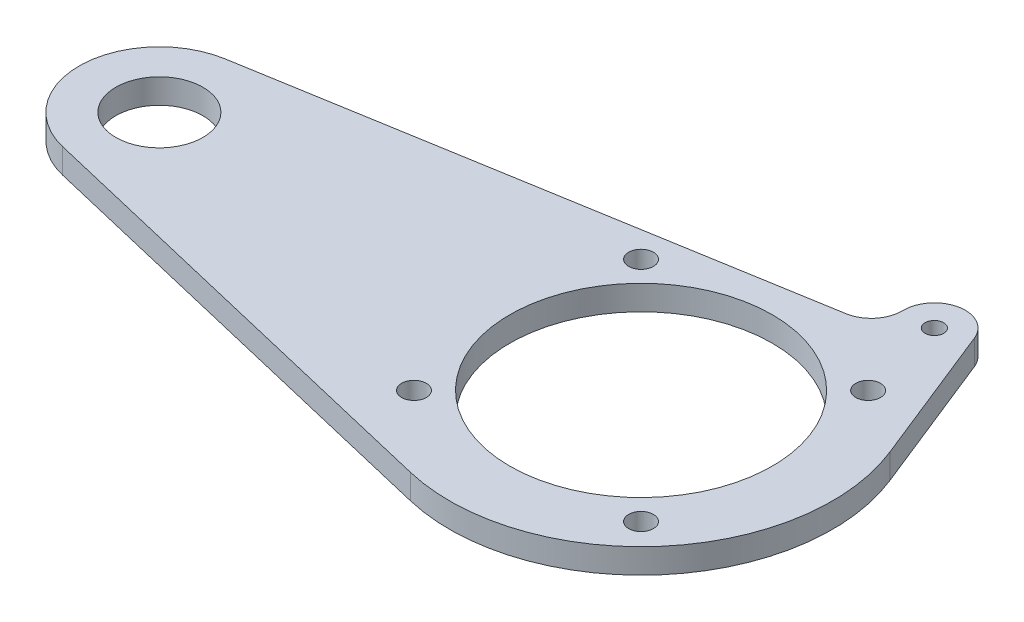
ISO-10303-21;
HEADER;
FILE_DESCRIPTION(('STEP AP214'),'2;1');
FILE_NAME('part.step','',(''),(''),'','','');
FILE_SCHEMA(('AUTOMOTIVE_DESIGN { 1 0 10303 214 1 1 1 1 }'));
ENDSEC;
DATA;
#1=APPLICATION_CONTEXT('core data for automotive mechanical design processes');
#2=APPLICATION_PROTOCOL_DEFINITION('international standard','automotive_design',2000,#1);
#3=PRODUCT_CONTEXT('',#1,'mechanical');
#4=PRODUCT('Part','Part','',(#3));
#5=PRODUCT_RELATED_PRODUCT_CATEGORY('part','',(#4));
#6=PRODUCT_DEFINITION_FORMATION('','',#4);
#7=PRODUCT_DEFINITION_CONTEXT('part definition',#1,'design');
#8=PRODUCT_DEFINITION('design','',#6,#7);
#9=PRODUCT_DEFINITION_SHAPE('','',#8);
#10=(LENGTH_UNIT() NAMED_UNIT(*) SI_UNIT(.MILLI.,.METRE.));
#11=(NAMED_UNIT(*) PLANE_ANGLE_UNIT() SI_UNIT($,.RADIAN.));
#12=(NAMED_UNIT(*) SI_UNIT($,.STERADIAN.) SOLID_ANGLE_UNIT());
#13=UNCERTAINTY_MEASURE_WITH_UNIT(LENGTH_MEASURE(1.E-05),#10,'distance_accuracy_value','');
#14=(GEOMETRIC_REPRESENTATION_CONTEXT(3) GLOBAL_UNCERTAINTY_ASSIGNED_CONTEXT((#13)) GLOBAL_UNIT_ASSIGNED_CONTEXT((#10,
#11,#12)) REPRESENTATION_CONTEXT('',''));
#15=CARTESIAN_POINT('',(0.,0.,0.));
#16=DIRECTION('',(0.,0.,1.));
#17=DIRECTION('',(1.,0.,0.));
#18=AXIS2_PLACEMENT_3D('',#15,#16,#17);
#19=CARTESIAN_POINT('',(5.00230545194057,4.,-32.2852822231327));
#20=DIRECTION('',(0.,-1.,0.));
#21=DIRECTION('',(0.,0.,-1.));
#22=AXIS2_PLACEMENT_3D('',#19,#20,#21);
#23=CYLINDRICAL_SURFACE('',#22,5.);
#24=CARTESIAN_POINT('',(5.00230545194057,0.,-32.2852822231327));
#25=DIRECTION('',(0.,1.,0.));
#26=DIRECTION('',(0.,0.,1.));
#27=AXIS2_PLACEMENT_3D('',#24,#25,#26);
#28=CIRCLE('',#27,5.);
#29=CARTESIAN_POINT('',(5.8356387852739,0.,-27.3552157372163));
#30=VERTEX_POINT('',#29);
#31=CARTESIAN_POINT('',(10.0011527259703,0.,-32.3926411115663));
#32=VERTEX_POINT('',#31);
#33=EDGE_CURVE('E168',#30,#32,#28,.T.);
#34=ORIENTED_EDGE('',*,*,#33,.F.);
#35=DIRECTION('',(0.,-1.,0.));
#36=VECTOR('',#35,1.);
#37=CARTESIAN_POINT('',(5.8356387852739,4.,-27.3552157372163));
#38=LINE('',#37,#36);
#39=CARTESIAN_POINT('',(5.8356387852739,4.,-27.3552157372163));
#40=VERTEX_POINT('',#39);
#41=EDGE_CURVE('E11',#40,#30,#38,.T.);
#42=ORIENTED_EDGE('',*,*,#41,.F.);
#43=CARTESIAN_POINT('',(5.00230545194057,4.,-32.2852822231327));
#44=DIRECTION('',(0.,1.,0.));
#45=DIRECTION('',(0.,0.,1.));
#46=AXIS2_PLACEMENT_3D('',#43,#44,#45);
#47=CIRCLE('',#46,5.);
#48=CARTESIAN_POINT('',(10.0011527259703,4.,-32.3926411115663));
#49=VERTEX_POINT('',#48);
#50=EDGE_CURVE('E243',#40,#49,#47,.T.);
#51=ORIENTED_EDGE('',*,*,#50,.T.);
#52=DIRECTION('',(0.,-1.,0.));
#53=VECTOR('',#52,1.);
#54=CARTESIAN_POINT('',(10.0011527259703,4.,-32.3926411115663));
#55=LINE('',#54,#53);
#56=EDGE_CURVE('E96',#49,#32,#55,.T.);
#57=ORIENTED_EDGE('',*,*,#56,.T.);
#58=EDGE_LOOP('',(#34,#42,#51,#57));
#59=FACE_BOUND('',#58,.T.);
#60=ADVANCED_FACE('F47',(#59),#23,.F.);
#61=CARTESIAN_POINT('',(-4.33333333333333,4.,-25.636345726765));
#62=DIRECTION('',(-0.166666666666667,0.,-0.986013297183269));
#63=DIRECTION('',(-0.986013297183269,0.,0.166666666666667));
#64=AXIS2_PLACEMENT_3D('',#61,#62,#63);
#65=PLANE('',#64);
#66=DIRECTION('',(0.986013297183269,0.,-0.166666666666667));
#67=VECTOR('',#66,1.);
#68=CARTESIAN_POINT('',(-4.33333333333333,0.,-25.636345726765));
#69=LINE('',#68,#67);
#70=CARTESIAN_POINT('',(-80.1666666666666,0.,-12.8181728633825));
#71=VERTEX_POINT('',#70);
#72=EDGE_CURVE('E172',#71,#30,#69,.T.);
#73=ORIENTED_EDGE('',*,*,#72,.F.);
#74=DIRECTION('',(0.,-1.,0.));
#75=VECTOR('',#74,1.);
#76=CARTESIAN_POINT('',(-80.1666666666666,4.,-12.8181728633825));
#77=LINE('',#76,#75);
#78=CARTESIAN_POINT('',(-80.1666666666666,4.,-12.8181728633825));
#79=VERTEX_POINT('',#78);
#80=EDGE_CURVE('E57',#79,#71,#77,.T.);
#81=ORIENTED_EDGE('',*,*,#80,.F.);
#82=DIRECTION('',(0.986013297183269,0.,-0.166666666666667));
#83=VECTOR('',#82,1.);
#84=CARTESIAN_POINT('',(-4.33333333333333,4.,-25.636345726765));
#85=LINE('',#84,#83);
#86=EDGE_CURVE('E241',#79,#40,#85,.T.);
#87=ORIENTED_EDGE('',*,*,#86,.T.);
#88=ORIENTED_EDGE('',*,*,#41,.T.);
#89=EDGE_LOOP('',(#73,#81,#87,#88));
#90=FACE_BOUND('',#89,.T.);
#91=ADVANCED_FACE('F240',(#90),#65,.T.);
#92=CARTESIAN_POINT('',(-78.,4.,0.));
#93=DIRECTION('',(0.,-1.,0.));
#94=DIRECTION('',(0.,0.,-1.));
#95=AXIS2_PLACEMENT_3D('',#92,#93,#94);
#96=CYLINDRICAL_SURFACE('',#95,13.);
#97=CARTESIAN_POINT('',(-78.,0.,0.));
#98=DIRECTION('',(0.,1.,0.));
#99=DIRECTION('',(0.,0.,1.));
#100=AXIS2_PLACEMENT_3D('',#97,#98,#99);
#101=CIRCLE('',#100,13.);
#102=CARTESIAN_POINT('',(-81.,0.,12.6491106406735));
#103=VERTEX_POINT('',#102);
#104=EDGE_CURVE('E176',#71,#103,#101,.T.);
#105=ORIENTED_EDGE('',*,*,#104,.T.);
#106=DIRECTION('',(0.,-1.,0.));
#107=VECTOR('',#106,1.);
#108=CARTESIAN_POINT('',(-81.,4.,12.6491106406735));
#109=LINE('',#108,#107);
#110=CARTESIAN_POINT('',(-81.,4.,12.6491106406735));
#111=VERTEX_POINT('',#110);
#112=EDGE_CURVE('E223',#111,#103,#109,.T.);
#113=ORIENTED_EDGE('',*,*,#112,.F.);
#114=CARTESIAN_POINT('',(-78.,4.,0.));
#115=DIRECTION('',(0.,1.,0.));
#116=DIRECTION('',(0.,0.,1.));
#117=AXIS2_PLACEMENT_3D('',#114,#115,#116);
#118=CIRCLE('',#117,13.);
#119=EDGE_CURVE('E232',#79,#111,#118,.T.);
#120=ORIENTED_EDGE('',*,*,#119,.F.);
#121=ORIENTED_EDGE('',*,*,#80,.T.);
#122=EDGE_LOOP('',(#105,#113,#120,#121));
#123=FACE_BOUND('',#122,.T.);
#124=ADVANCED_FACE('F230',(#123),#96,.T.);
#125=CARTESIAN_POINT('',(-7.15384615384617,4.,30.1632638354523));
#126=DIRECTION('',(0.230769230769231,0.,-0.97300851082104));
#127=DIRECTION('',(-0.97300851082104,0.,-0.230769230769231));
#128=AXIS2_PLACEMENT_3D('',#125,#126,#127);
#129=PLANE('',#128);
#130=DIRECTION('',(0.97300851082104,0.,0.230769230769231));
#131=VECTOR('',#130,1.);
#132=CARTESIAN_POINT('',(-7.15384615384617,0.,30.1632638354523));
#133=LINE('',#132,#131);
#134=CARTESIAN_POINT('',(-7.15384615384616,0.,30.1632638354523));
#135=VERTEX_POINT('',#134);
#136=EDGE_CURVE('E180',#103,#135,#133,.T.);
#137=ORIENTED_EDGE('',*,*,#136,.T.);
#138=DIRECTION('',(0.,-1.,0.));
#139=VECTOR('',#138,1.);
#140=CARTESIAN_POINT('',(-7.15384615384616,4.,30.1632638354523));
#141=LINE('',#140,#139);
#142=CARTESIAN_POINT('',(-7.15384615384616,4.,30.1632638354523));
#143=VERTEX_POINT('',#142);
#144=EDGE_CURVE('E131',#143,#135,#141,.T.);
#145=ORIENTED_EDGE('',*,*,#144,.F.);
#146=DIRECTION('',(0.97300851082104,0.,0.230769230769231));
#147=VECTOR('',#146,1.);
#148=CARTESIAN_POINT('',(-7.15384615384617,4.,30.1632638354523));
#149=LINE('',#148,#147);
#150=EDGE_CURVE('E117',#111,#143,#149,.T.);
#151=ORIENTED_EDGE('',*,*,#150,.F.);
#152=ORIENTED_EDGE('',*,*,#112,.T.);
#153=EDGE_LOOP('',(#137,#145,#151,#152));
#154=FACE_BOUND('',#153,.T.);
#155=ADVANCED_FACE('F255',(#154),#129,.F.);
#156=CARTESIAN_POINT('',(0.,4.,0.));
#157=DIRECTION('',(0.,-1.,0.));
#158=DIRECTION('',(0.,0.,-1.));
#159=AXIS2_PLACEMENT_3D('',#156,#157,#158);
#160=CYLINDRICAL_SURFACE('',#159,31.);
#161=CARTESIAN_POINT('',(0.,0.,0.));
#162=DIRECTION('',(0.,1.,0.));
#163=DIRECTION('',(0.,0.,1.));
#164=AXIS2_PLACEMENT_3D('',#161,#162,#163);
#165=CIRCLE('',#164,31.);
#166=CARTESIAN_POINT('',(28.7815359370047,0.,-11.5162141829209));
#167=VERTEX_POINT('',#166);
#168=EDGE_CURVE('E126',#135,#167,#165,.T.);
#169=ORIENTED_EDGE('',*,*,#168,.T.);
#170=DIRECTION('',(0.,-1.,0.));
#171=VECTOR('',#170,1.);
#172=CARTESIAN_POINT('',(28.7815359370047,4.,-11.5162141829209));
#173=LINE('',#172,#171);
#174=CARTESIAN_POINT('',(28.7815359370047,4.,-11.5162141829209));
#175=VERTEX_POINT('',#174);
#176=EDGE_CURVE('E124',#175,#167,#173,.T.);
#177=ORIENTED_EDGE('',*,*,#176,.F.);
#178=CARTESIAN_POINT('',(0.,4.,0.));
#179=DIRECTION('',(0.,1.,0.));
#180=DIRECTION('',(0.,0.,1.));
#181=AXIS2_PLACEMENT_3D('',#178,#179,#180);
#182=CIRCLE('',#181,31.);
#183=EDGE_CURVE('E110',#143,#175,#182,.T.);
#184=ORIENTED_EDGE('',*,*,#183,.F.);
#185=ORIENTED_EDGE('',*,*,#144,.T.);
#186=EDGE_LOOP('',(#169,#177,#184,#185));
#187=FACE_BOUND('',#186,.T.);
#188=ADVANCED_FACE('F125',(#187),#160,.T.);
#189=CARTESIAN_POINT('',(28.7815359370047,4.,-11.5162141829209));
#190=DIRECTION('',(0.928436643129183,0.,-0.371490780094224));
#191=DIRECTION('',(-0.371490780094224,0.,-0.928436643129183));
#192=AXIS2_PLACEMENT_3D('',#189,#190,#191);
#193=PLANE('',#192);
#194=DIRECTION('',(0.371490780094224,0.,0.928436643129183));
#195=VECTOR('',#194,1.);
#196=CARTESIAN_POINT('',(28.7815359370047,0.,-11.5162141829209));
#197=LINE('',#196,#195);
#198=CARTESIAN_POINT('',(19.6421832156459,0.,-34.3574539004711));
#199=VERTEX_POINT('',#198);
#200=EDGE_CURVE('E186',#199,#167,#197,.T.);
#201=ORIENTED_EDGE('',*,*,#200,.F.);
#202=DIRECTION('',(0.,-1.,0.));
#203=VECTOR('',#202,1.);
#204=CARTESIAN_POINT('',(19.6421832156459,4.,-34.3574539004711));
#205=LINE('',#204,#203);
#206=CARTESIAN_POINT('',(19.6421832156459,4.,-34.3574539004711));
#207=VERTEX_POINT('',#206);
#208=EDGE_CURVE('E89',#207,#199,#205,.T.);
#209=ORIENTED_EDGE('',*,*,#208,.F.);
#210=DIRECTION('',(0.371490780094224,0.,0.928436643129183));
#211=VECTOR('',#210,1.);
#212=CARTESIAN_POINT('',(28.7815359370047,4.,-11.5162141829209));
#213=LINE('',#212,#211);
#214=EDGE_CURVE('E115',#207,#175,#213,.T.);
#215=ORIENTED_EDGE('',*,*,#214,.T.);
#216=ORIENTED_EDGE('',*,*,#176,.T.);
#217=EDGE_LOOP('',(#201,#209,#215,#216));
#218=FACE_BOUND('',#217,.T.);
#219=ADVANCED_FACE('F133',(#218),#193,.T.);
#220=CARTESIAN_POINT('',(15.,4.,-32.5));
#221=DIRECTION('',(0.,-1.,0.));
#222=DIRECTION('',(0.,0.,-1.));
#223=AXIS2_PLACEMENT_3D('',#220,#221,#222);
#224=CYLINDRICAL_SURFACE('',#223,1.5);
#225=CARTESIAN_POINT('',(15.,4.,-32.5));
#226=DIRECTION('',(0.,1.,0.));
#227=DIRECTION('',(0.,0.,1.));
#228=AXIS2_PLACEMENT_3D('',#225,#226,#227);
#229=CIRCLE('',#228,1.5);
#230=CARTESIAN_POINT('',(15.,4.,-31.));
#231=VERTEX_POINT('',#230);
#232=EDGE_CURVE('E156',#231,#231,#229,.T.);
#233=ORIENTED_EDGE('',*,*,#232,.T.);
#234=EDGE_LOOP('',(#233));
#235=FACE_BOUND('',#234,.T.);
#236=CARTESIAN_POINT('',(15.,0.,-32.5));
#237=DIRECTION('',(0.,1.,0.));
#238=DIRECTION('',(0.,0.,1.));
#239=AXIS2_PLACEMENT_3D('',#236,#237,#238);
#240=CIRCLE('',#239,1.5);
#241=CARTESIAN_POINT('',(15.,0.,-31.));
#242=VERTEX_POINT('',#241);
#243=EDGE_CURVE('E208',#242,#242,#240,.T.);
#244=ORIENTED_EDGE('',*,*,#243,.F.);
#245=EDGE_LOOP('',(#244));
#246=FACE_BOUND('',#245,.T.);
#247=ADVANCED_FACE('F296',(#235,#246),#224,.F.);
#248=CARTESIAN_POINT('',(-18.3847763108502,4.,-18.3847763108503));
#249=DIRECTION('',(0.,-1.,0.));
#250=DIRECTION('',(0.,0.,-1.));
#251=AXIS2_PLACEMENT_3D('',#248,#249,#250);
#252=CYLINDRICAL_SURFACE('',#251,1.99999999999999);
#253=CARTESIAN_POINT('',(-18.3847763108502,4.,-18.3847763108503));
#254=DIRECTION('',(0.,1.,0.));
#255=DIRECTION('',(0.,0.,1.));
#256=AXIS2_PLACEMENT_3D('',#253,#254,#255);
#257=CIRCLE('',#256,1.99999999999999);
#258=CARTESIAN_POINT('',(-18.3847763108502,4.,-16.3847763108503));
#259=VERTEX_POINT('',#258);
#260=EDGE_CURVE('E152',#259,#259,#257,.T.);
#261=ORIENTED_EDGE('',*,*,#260,.T.);
#262=EDGE_LOOP('',(#261));
#263=FACE_BOUND('',#262,.T.);
#264=CARTESIAN_POINT('',(-18.3847763108502,0.,-18.3847763108503));
#265=DIRECTION('',(0.,1.,0.));
#266=DIRECTION('',(0.,0.,1.));
#267=AXIS2_PLACEMENT_3D('',#264,#265,#266);
#268=CIRCLE('',#267,1.99999999999999);
#269=CARTESIAN_POINT('',(-18.3847763108502,0.,-16.3847763108503));
#270=VERTEX_POINT('',#269);
#271=EDGE_CURVE('E204',#270,#270,#268,.T.);
#272=ORIENTED_EDGE('',*,*,#271,.F.);
#273=EDGE_LOOP('',(#272));
#274=FACE_BOUND('',#273,.T.);
#275=ADVANCED_FACE('F305',(#263,#274),#252,.F.);
#276=CARTESIAN_POINT('',(18.3847763108503,4.,-18.3847763108502));
#277=DIRECTION('',(0.,-1.,0.));
#278=DIRECTION('',(0.,0.,-1.));
#279=AXIS2_PLACEMENT_3D('',#276,#277,#278);
#280=CYLINDRICAL_SURFACE('',#279,2.00000000000001);
#281=CARTESIAN_POINT('',(18.3847763108503,4.,-18.3847763108502));
#282=DIRECTION('',(0.,1.,0.));
#283=DIRECTION('',(0.,0.,1.));
#284=AXIS2_PLACEMENT_3D('',#281,#282,#283);
#285=CIRCLE('',#284,2.00000000000001);
#286=CARTESIAN_POINT('',(18.3847763108503,4.,-16.3847763108502));
#287=VERTEX_POINT('',#286);
#288=EDGE_CURVE('E148',#287,#287,#285,.T.);
#289=ORIENTED_EDGE('',*,*,#288,.T.);
#290=EDGE_LOOP('',(#289));
#291=FACE_BOUND('',#290,.T.);
#292=CARTESIAN_POINT('',(18.3847763108503,0.,-18.3847763108502));
#293=DIRECTION('',(0.,1.,0.));
#294=DIRECTION('',(0.,0.,1.));
#295=AXIS2_PLACEMENT_3D('',#292,#293,#294);
#296=CIRCLE('',#295,2.00000000000001);
#297=CARTESIAN_POINT('',(18.3847763108503,0.,-16.3847763108502));
#298=VERTEX_POINT('',#297);
#299=EDGE_CURVE('E200',#298,#298,#296,.T.);
#300=ORIENTED_EDGE('',*,*,#299,.F.);
#301=EDGE_LOOP('',(#300));
#302=FACE_BOUND('',#301,.T.);
#303=ADVANCED_FACE('F315',(#291,#302),#280,.F.);
#304=CARTESIAN_POINT('',(18.3847763108502,4.,18.3847763108503));
#305=DIRECTION('',(0.,-1.,0.));
#306=DIRECTION('',(0.,0.,-1.));
#307=AXIS2_PLACEMENT_3D('',#304,#305,#306);
#308=CYLINDRICAL_SURFACE('',#307,2.);
#309=CARTESIAN_POINT('',(18.3847763108502,4.,18.3847763108503));
#310=DIRECTION('',(0.,1.,0.));
#311=DIRECTION('',(0.,0.,1.));
#312=AXIS2_PLACEMENT_3D('',#309,#310,#311);
#313=CIRCLE('',#312,2.);
#314=CARTESIAN_POINT('',(18.3847763108502,4.,20.3847763108503));
#315=VERTEX_POINT('',#314);
#316=EDGE_CURVE('E144',#315,#315,#313,.T.);
#317=ORIENTED_EDGE('',*,*,#316,.T.);
#318=EDGE_LOOP('',(#317));
#319=FACE_BOUND('',#318,.T.);
#320=CARTESIAN_POINT('',(18.3847763108502,0.,18.3847763108503));
#321=DIRECTION('',(0.,1.,0.));
#322=DIRECTION('',(0.,0.,1.));
#323=AXIS2_PLACEMENT_3D('',#320,#321,#322);
#324=CIRCLE('',#323,2.);
#325=CARTESIAN_POINT('',(18.3847763108502,0.,20.3847763108503));
#326=VERTEX_POINT('',#325);
#327=EDGE_CURVE('E196',#326,#326,#324,.T.);
#328=ORIENTED_EDGE('',*,*,#327,.F.);
#329=EDGE_LOOP('',(#328));
#330=FACE_BOUND('',#329,.T.);
#331=ADVANCED_FACE('F325',(#319,#330),#308,.F.);
#332=CARTESIAN_POINT('',(-18.3847763108503,4.,18.3847763108502));
#333=DIRECTION('',(0.,-1.,0.));
#334=DIRECTION('',(0.,0.,-1.));
#335=AXIS2_PLACEMENT_3D('',#332,#333,#334);
#336=CYLINDRICAL_SURFACE('',#335,2.);
#337=CARTESIAN_POINT('',(-18.3847763108503,4.,18.3847763108502));
#338=DIRECTION('',(0.,1.,0.));
#339=DIRECTION('',(0.,0.,1.));
#340=AXIS2_PLACEMENT_3D('',#337,#338,#339);
#341=CIRCLE('',#340,2.);
#342=CARTESIAN_POINT('',(-18.3847763108503,4.,20.3847763108502));
#343=VERTEX_POINT('',#342);
#344=EDGE_CURVE('E137',#343,#343,#341,.T.);
#345=ORIENTED_EDGE('',*,*,#344,.T.);
#346=EDGE_LOOP('',(#345));
#347=FACE_BOUND('',#346,.T.);
#348=CARTESIAN_POINT('',(-18.3847763108503,0.,18.3847763108502));
#349=DIRECTION('',(0.,1.,0.));
#350=DIRECTION('',(0.,0.,1.));
#351=AXIS2_PLACEMENT_3D('',#348,#349,#350);
#352=CIRCLE('',#351,2.);
#353=CARTESIAN_POINT('',(-18.3847763108503,0.,20.3847763108502));
#354=VERTEX_POINT('',#353);
#355=EDGE_CURVE('E192',#354,#354,#352,.T.);
#356=ORIENTED_EDGE('',*,*,#355,.F.);
#357=EDGE_LOOP('',(#356));
#358=FACE_BOUND('',#357,.T.);
#359=ADVANCED_FACE('F335',(#347,#358),#336,.F.);
#360=CARTESIAN_POINT('',(15.,4.,-32.5));
#361=DIRECTION('',(0.,-1.,0.));
#362=DIRECTION('',(0.,0.,-1.));
#363=AXIS2_PLACEMENT_3D('',#360,#361,#362);
#364=CYLINDRICAL_SURFACE('',#363,5.);
#365=CARTESIAN_POINT('',(15.,0.,-32.5));
#366=DIRECTION('',(0.,1.,0.));
#367=DIRECTION('',(0.,0.,1.));
#368=AXIS2_PLACEMENT_3D('',#365,#366,#367);
#369=CIRCLE('',#368,5.);
#370=EDGE_CURVE('E189',#199,#32,#369,.T.);
#371=ORIENTED_EDGE('',*,*,#370,.T.);
#372=ORIENTED_EDGE('',*,*,#56,.F.);
#373=CARTESIAN_POINT('',(15.,4.,-32.5));
#374=DIRECTION('',(0.,1.,0.));
#375=DIRECTION('',(0.,0.,1.));
#376=AXIS2_PLACEMENT_3D('',#373,#374,#375);
#377=CIRCLE('',#376,5.);
#378=EDGE_CURVE('E65',#207,#49,#377,.T.);
#379=ORIENTED_EDGE('',*,*,#378,.F.);
#380=ORIENTED_EDGE('',*,*,#208,.T.);
#381=EDGE_LOOP('',(#371,#372,#379,#380));
#382=FACE_BOUND('',#381,.T.);
#383=ADVANCED_FACE('F242',(#382),#364,.T.);
#384=CARTESIAN_POINT('',(0.,4.,0.));
#385=DIRECTION('',(0.,-1.,0.));
#386=DIRECTION('',(0.,0.,-1.));
#387=AXIS2_PLACEMENT_3D('',#384,#385,#386);
#388=CYLINDRICAL_SURFACE('',#387,21.25);
#389=CARTESIAN_POINT('',(0.,4.,0.));
#390=DIRECTION('',(0.,1.,0.));
#391=DIRECTION('',(0.,0.,1.));
#392=AXIS2_PLACEMENT_3D('',#389,#390,#391);
#393=CIRCLE('',#392,21.25);
#394=CARTESIAN_POINT('',(0.,4.,21.25));
#395=VERTEX_POINT('',#394);
#396=EDGE_CURVE('E216',#395,#395,#393,.T.);
#397=ORIENTED_EDGE('',*,*,#396,.T.);
#398=EDGE_LOOP('',(#397));
#399=FACE_BOUND('',#398,.T.);
#400=CARTESIAN_POINT('',(0.,0.,0.));
#401=DIRECTION('',(0.,1.,0.));
#402=DIRECTION('',(0.,0.,1.));
#403=AXIS2_PLACEMENT_3D('',#400,#401,#402);
#404=CIRCLE('',#403,21.25);
#405=CARTESIAN_POINT('',(0.,0.,21.25));
#406=VERTEX_POINT('',#405);
#407=EDGE_CURVE('E164',#406,#406,#404,.T.);
#408=ORIENTED_EDGE('',*,*,#407,.F.);
#409=EDGE_LOOP('',(#408));
#410=FACE_BOUND('',#409,.T.);
#411=ADVANCED_FACE('F49',(#399,#410),#388,.F.);
#412=CARTESIAN_POINT('',(-78.,4.,0.));
#413=DIRECTION('',(0.,-1.,0.));
#414=DIRECTION('',(0.,0.,-1.));
#415=AXIS2_PLACEMENT_3D('',#412,#413,#414);
#416=CYLINDRICAL_SURFACE('',#415,7.05);
#417=CARTESIAN_POINT('',(-78.,4.,0.));
#418=DIRECTION('',(0.,1.,0.));
#419=DIRECTION('',(0.,0.,1.));
#420=AXIS2_PLACEMENT_3D('',#417,#418,#419);
#421=CIRCLE('',#420,7.05);
#422=CARTESIAN_POINT('',(-78.,4.,7.05));
#423=VERTEX_POINT('',#422);
#424=EDGE_CURVE('E160',#423,#423,#421,.T.);
#425=ORIENTED_EDGE('',*,*,#424,.T.);
#426=EDGE_LOOP('',(#425));
#427=FACE_BOUND('',#426,.T.);
#428=CARTESIAN_POINT('',(-78.,0.,0.));
#429=DIRECTION('',(0.,1.,0.));
#430=DIRECTION('',(0.,0.,1.));
#431=AXIS2_PLACEMENT_3D('',#428,#429,#430);
#432=CIRCLE('',#431,7.05);
#433=CARTESIAN_POINT('',(-78.,0.,7.05));
#434=VERTEX_POINT('',#433);
#435=EDGE_CURVE('E212',#434,#434,#432,.T.);
#436=ORIENTED_EDGE('',*,*,#435,.F.);
#437=EDGE_LOOP('',(#436));
#438=FACE_BOUND('',#437,.T.);
#439=ADVANCED_FACE('F362',(#427,#438),#416,.F.);
#440=CARTESIAN_POINT('',(0.,4.,0.));
#441=DIRECTION('',(0.,1.,0.));
#442=DIRECTION('',(0.,0.,1.));
#443=AXIS2_PLACEMENT_3D('',#440,#441,#442);
#444=PLANE('',#443);
#445=ORIENTED_EDGE('',*,*,#396,.F.);
#446=EDGE_LOOP('',(#445));
#447=FACE_BOUND('',#446,.T.);
#448=ORIENTED_EDGE('',*,*,#50,.F.);
#449=ORIENTED_EDGE('',*,*,#86,.F.);
#450=ORIENTED_EDGE('',*,*,#119,.T.);
#451=ORIENTED_EDGE('',*,*,#150,.T.);
#452=ORIENTED_EDGE('',*,*,#183,.T.);
#453=ORIENTED_EDGE('',*,*,#214,.F.);
#454=ORIENTED_EDGE('',*,*,#378,.T.);
#455=EDGE_LOOP('',(#448,#449,#450,#451,#452,#453,#454));
#456=FACE_BOUND('',#455,.T.);
#457=ORIENTED_EDGE('',*,*,#344,.F.);
#458=EDGE_LOOP('',(#457));
#459=FACE_BOUND('',#458,.T.);
#460=ORIENTED_EDGE('',*,*,#316,.F.);
#461=EDGE_LOOP('',(#460));
#462=FACE_BOUND('',#461,.T.);
#463=ORIENTED_EDGE('',*,*,#288,.F.);
#464=EDGE_LOOP('',(#463));
#465=FACE_BOUND('',#464,.T.);
#466=ORIENTED_EDGE('',*,*,#260,.F.);
#467=EDGE_LOOP('',(#466));
#468=FACE_BOUND('',#467,.T.);
#469=ORIENTED_EDGE('',*,*,#232,.F.);
#470=EDGE_LOOP('',(#469));
#471=FACE_BOUND('',#470,.T.);
#472=ORIENTED_EDGE('',*,*,#424,.F.);
#473=EDGE_LOOP('',(#472));
#474=FACE_BOUND('',#473,.T.);
#475=ADVANCED_FACE('F112',(#447,#456,#459,#462,#465,#468,#471,#474),#444,.T.);
#476=CARTESIAN_POINT('',(0.,0.,0.));
#477=DIRECTION('',(0.,1.,0.));
#478=DIRECTION('',(0.,0.,1.));
#479=AXIS2_PLACEMENT_3D('',#476,#477,#478);
#480=PLANE('',#479);
#481=ORIENTED_EDGE('',*,*,#407,.T.);
#482=EDGE_LOOP('',(#481));
#483=FACE_BOUND('',#482,.T.);
#484=ORIENTED_EDGE('',*,*,#33,.T.);
#485=ORIENTED_EDGE('',*,*,#370,.F.);
#486=ORIENTED_EDGE('',*,*,#200,.T.);
#487=ORIENTED_EDGE('',*,*,#168,.F.);
#488=ORIENTED_EDGE('',*,*,#136,.F.);
#489=ORIENTED_EDGE('',*,*,#104,.F.);
#490=ORIENTED_EDGE('',*,*,#72,.T.);
#491=EDGE_LOOP('',(#484,#485,#486,#487,#488,#489,#490));
#492=FACE_BOUND('',#491,.T.);
#493=ORIENTED_EDGE('',*,*,#355,.T.);
#494=EDGE_LOOP('',(#493));
#495=FACE_BOUND('',#494,.T.);
#496=ORIENTED_EDGE('',*,*,#327,.T.);
#497=EDGE_LOOP('',(#496));
#498=FACE_BOUND('',#497,.T.);
#499=ORIENTED_EDGE('',*,*,#299,.T.);
#500=EDGE_LOOP('',(#499));
#501=FACE_BOUND('',#500,.T.);
#502=ORIENTED_EDGE('',*,*,#271,.T.);
#503=EDGE_LOOP('',(#502));
#504=FACE_BOUND('',#503,.T.);
#505=ORIENTED_EDGE('',*,*,#243,.T.);
#506=EDGE_LOOP('',(#505));
#507=FACE_BOUND('',#506,.T.);
#508=ORIENTED_EDGE('',*,*,#435,.T.);
#509=EDGE_LOOP('',(#508));
#510=FACE_BOUND('',#509,.T.);
#511=ADVANCED_FACE('F238',(#483,#492,#495,#498,#501,#504,#507,#510),#480,.F.);
#512=CLOSED_SHELL('',(#60,#91,#124,#155,#188,#219,#247,#275,#303,#331,#359,#383,#411,#439,#475,#511));
#513=MANIFOLD_SOLID_BREP('B2',#512);
#514=ADVANCED_BREP_SHAPE_REPRESENTATION('',(#18,#513),#14);
#515=SHAPE_DEFINITION_REPRESENTATION(#9,#514);
ENDSEC;
END-ISO-10303-21;
